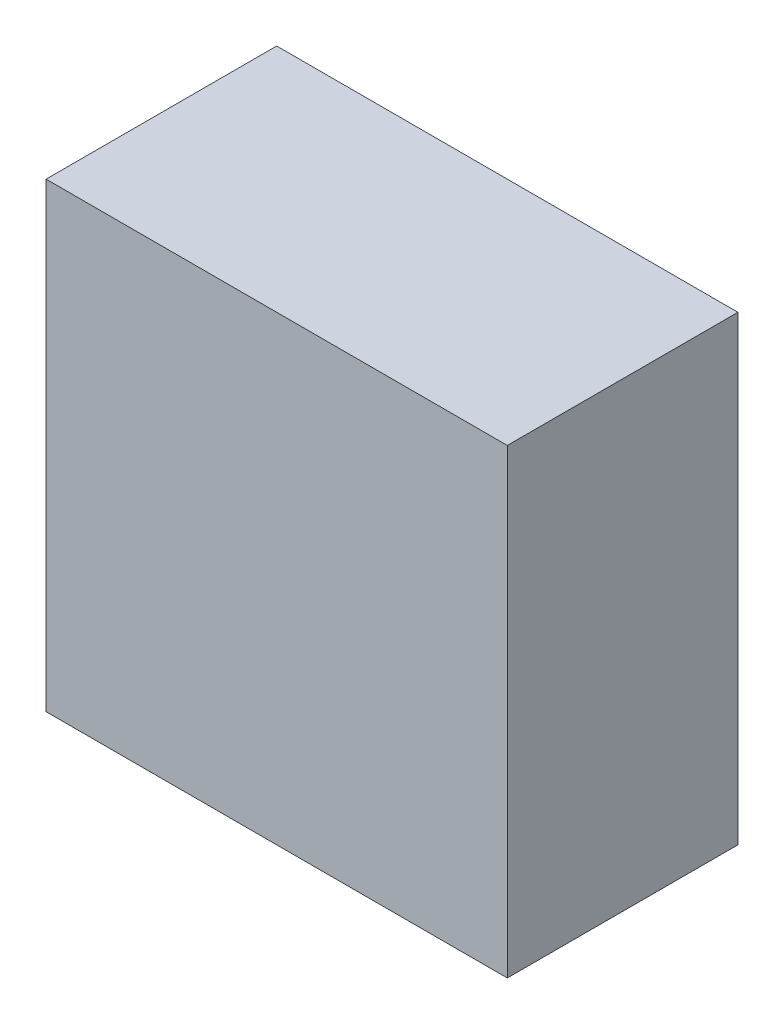
ISO-10303-21;
HEADER;
FILE_DESCRIPTION(('STEP AP214'),'2;1');
FILE_NAME('part.step','',(''),(''),'','','');
FILE_SCHEMA(('AUTOMOTIVE_DESIGN { 1 0 10303 214 1 1 1 1 }'));
ENDSEC;
DATA;
#1=APPLICATION_CONTEXT('core data for automotive mechanical design processes');
#2=APPLICATION_PROTOCOL_DEFINITION('international standard','automotive_design',2000,#1);
#3=PRODUCT_CONTEXT('',#1,'mechanical');
#4=PRODUCT('Part','Part','',(#3));
#5=PRODUCT_RELATED_PRODUCT_CATEGORY('part','',(#4));
#6=PRODUCT_DEFINITION_FORMATION('','',#4);
#7=PRODUCT_DEFINITION_CONTEXT('part definition',#1,'design');
#8=PRODUCT_DEFINITION('design','',#6,#7);
#9=PRODUCT_DEFINITION_SHAPE('','',#8);
#10=(LENGTH_UNIT() NAMED_UNIT(*) SI_UNIT(.MILLI.,.METRE.));
#11=(NAMED_UNIT(*) PLANE_ANGLE_UNIT() SI_UNIT($,.RADIAN.));
#12=(NAMED_UNIT(*) SI_UNIT($,.STERADIAN.) SOLID_ANGLE_UNIT());
#13=UNCERTAINTY_MEASURE_WITH_UNIT(LENGTH_MEASURE(1.E-05),#10,'distance_accuracy_value','');
#14=(GEOMETRIC_REPRESENTATION_CONTEXT(3) GLOBAL_UNCERTAINTY_ASSIGNED_CONTEXT((#13)) GLOBAL_UNIT_ASSIGNED_CONTEXT((#10,
#11,#12)) REPRESENTATION_CONTEXT('',''));
#15=CARTESIAN_POINT('',(0.,0.,0.));
#16=DIRECTION('',(0.,0.,1.));
#17=DIRECTION('',(1.,0.,0.));
#18=AXIS2_PLACEMENT_3D('',#15,#16,#17);
#19=CARTESIAN_POINT('',(-1.,-1.,1.));
#20=DIRECTION('',(1.,0.,0.));
#21=DIRECTION('',(0.,0.,-1.));
#22=AXIS2_PLACEMENT_3D('',#19,#20,#21);
#23=PLANE('',#22);
#24=DIRECTION('',(0.,-1.,0.));
#25=VECTOR('',#24,1.);
#26=CARTESIAN_POINT('',(-1.,-1.,0.));
#27=LINE('',#26,#25);
#28=CARTESIAN_POINT('',(-1.,1.,0.));
#29=VERTEX_POINT('',#28);
#30=CARTESIAN_POINT('',(-1.,-1.,0.));
#31=VERTEX_POINT('',#30);
#32=EDGE_CURVE('E95',#29,#31,#27,.T.);
#33=ORIENTED_EDGE('',*,*,#32,.T.);
#34=DIRECTION('',(0.,0.,-1.));
#35=VECTOR('',#34,1.);
#36=CARTESIAN_POINT('',(-1.,-1.,1.));
#37=LINE('',#36,#35);
#38=CARTESIAN_POINT('',(-1.,-1.,1.));
#39=VERTEX_POINT('',#38);
#40=EDGE_CURVE('E11',#39,#31,#37,.T.);
#41=ORIENTED_EDGE('',*,*,#40,.F.);
#42=DIRECTION('',(0.,-1.,0.));
#43=VECTOR('',#42,1.);
#44=CARTESIAN_POINT('',(-1.,-1.,1.));
#45=LINE('',#44,#43);
#46=CARTESIAN_POINT('',(-1.,1.,1.));
#47=VERTEX_POINT('',#46);
#48=EDGE_CURVE('E83',#47,#39,#45,.T.);
#49=ORIENTED_EDGE('',*,*,#48,.F.);
#50=DIRECTION('',(0.,0.,-1.));
#51=VECTOR('',#50,1.);
#52=CARTESIAN_POINT('',(-1.,1.,1.));
#53=LINE('',#52,#51);
#54=EDGE_CURVE('E91',#47,#29,#53,.T.);
#55=ORIENTED_EDGE('',*,*,#54,.T.);
#56=EDGE_LOOP('',(#33,#41,#49,#55));
#57=FACE_BOUND('',#56,.T.);
#58=ADVANCED_FACE('F32',(#57),#23,.F.);
#59=CARTESIAN_POINT('',(1.,-1.,1.));
#60=DIRECTION('',(0.,1.,0.));
#61=DIRECTION('',(0.,0.,1.));
#62=AXIS2_PLACEMENT_3D('',#59,#60,#61);
#63=PLANE('',#62);
#64=DIRECTION('',(1.,0.,0.));
#65=VECTOR('',#64,1.);
#66=CARTESIAN_POINT('',(1.,-1.,0.));
#67=LINE('',#66,#65);
#68=CARTESIAN_POINT('',(1.,-1.,0.));
#69=VERTEX_POINT('',#68);
#70=EDGE_CURVE('E87',#31,#69,#67,.T.);
#71=ORIENTED_EDGE('',*,*,#70,.T.);
#72=DIRECTION('',(0.,0.,-1.));
#73=VECTOR('',#72,1.);
#74=CARTESIAN_POINT('',(1.,-1.,1.));
#75=LINE('',#74,#73);
#76=CARTESIAN_POINT('',(1.,-1.,1.));
#77=VERTEX_POINT('',#76);
#78=EDGE_CURVE('E40',#77,#69,#75,.T.);
#79=ORIENTED_EDGE('',*,*,#78,.F.);
#80=DIRECTION('',(1.,0.,0.));
#81=VECTOR('',#80,1.);
#82=CARTESIAN_POINT('',(1.,-1.,1.));
#83=LINE('',#82,#81);
#84=EDGE_CURVE('E78',#39,#77,#83,.T.);
#85=ORIENTED_EDGE('',*,*,#84,.F.);
#86=ORIENTED_EDGE('',*,*,#40,.T.);
#87=EDGE_LOOP('',(#71,#79,#85,#86));
#88=FACE_BOUND('',#87,.T.);
#89=ADVANCED_FACE('F86',(#88),#63,.F.);
#90=CARTESIAN_POINT('',(1.,1.,1.));
#91=DIRECTION('',(-1.,0.,0.));
#92=DIRECTION('',(0.,0.,1.));
#93=AXIS2_PLACEMENT_3D('',#90,#91,#92);
#94=PLANE('',#93);
#95=DIRECTION('',(0.,1.,0.));
#96=VECTOR('',#95,1.);
#97=CARTESIAN_POINT('',(1.,1.,0.));
#98=LINE('',#97,#96);
#99=CARTESIAN_POINT('',(1.,1.,0.));
#100=VERTEX_POINT('',#99);
#101=EDGE_CURVE('E65',#69,#100,#98,.T.);
#102=ORIENTED_EDGE('',*,*,#101,.T.);
#103=DIRECTION('',(0.,0.,-1.));
#104=VECTOR('',#103,1.);
#105=CARTESIAN_POINT('',(1.,1.,1.));
#106=LINE('',#105,#104);
#107=CARTESIAN_POINT('',(1.,1.,1.));
#108=VERTEX_POINT('',#107);
#109=EDGE_CURVE('E88',#108,#100,#106,.T.);
#110=ORIENTED_EDGE('',*,*,#109,.F.);
#111=DIRECTION('',(0.,1.,0.));
#112=VECTOR('',#111,1.);
#113=CARTESIAN_POINT('',(1.,1.,1.));
#114=LINE('',#113,#112);
#115=EDGE_CURVE('E81',#77,#108,#114,.T.);
#116=ORIENTED_EDGE('',*,*,#115,.F.);
#117=ORIENTED_EDGE('',*,*,#78,.T.);
#118=EDGE_LOOP('',(#102,#110,#116,#117));
#119=FACE_BOUND('',#118,.T.);
#120=ADVANCED_FACE('F89',(#119),#94,.F.);
#121=CARTESIAN_POINT('',(-1.,1.,1.));
#122=DIRECTION('',(0.,-1.,0.));
#123=DIRECTION('',(0.,0.,-1.));
#124=AXIS2_PLACEMENT_3D('',#121,#122,#123);
#125=PLANE('',#124);
#126=DIRECTION('',(-1.,0.,0.));
#127=VECTOR('',#126,1.);
#128=CARTESIAN_POINT('',(-1.,1.,0.));
#129=LINE('',#128,#127);
#130=EDGE_CURVE('E71',#100,#29,#129,.T.);
#131=ORIENTED_EDGE('',*,*,#130,.T.);
#132=ORIENTED_EDGE('',*,*,#54,.F.);
#133=DIRECTION('',(-1.,0.,0.));
#134=VECTOR('',#133,1.);
#135=CARTESIAN_POINT('',(-1.,1.,1.));
#136=LINE('',#135,#134);
#137=EDGE_CURVE('E48',#108,#47,#136,.T.);
#138=ORIENTED_EDGE('',*,*,#137,.F.);
#139=ORIENTED_EDGE('',*,*,#109,.T.);
#140=EDGE_LOOP('',(#131,#132,#138,#139));
#141=FACE_BOUND('',#140,.T.);
#142=ADVANCED_FACE('F102',(#141),#125,.F.);
#143=CARTESIAN_POINT('',(0.,0.,1.));
#144=DIRECTION('',(0.,0.,-1.));
#145=DIRECTION('',(-1.,0.,0.));
#146=AXIS2_PLACEMENT_3D('',#143,#144,#145);
#147=PLANE('',#146);
#148=ORIENTED_EDGE('',*,*,#48,.T.);
#149=ORIENTED_EDGE('',*,*,#84,.T.);
#150=ORIENTED_EDGE('',*,*,#115,.T.);
#151=ORIENTED_EDGE('',*,*,#137,.T.);
#152=EDGE_LOOP('',(#148,#149,#150,#151));
#153=FACE_BOUND('',#152,.T.);
#154=ADVANCED_FACE('F79',(#153),#147,.F.);
#155=CARTESIAN_POINT('',(0.,0.,0.));
#156=DIRECTION('',(0.,0.,-1.));
#157=DIRECTION('',(-1.,0.,0.));
#158=AXIS2_PLACEMENT_3D('',#155,#156,#157);
#159=PLANE('',#158);
#160=ORIENTED_EDGE('',*,*,#32,.F.);
#161=ORIENTED_EDGE('',*,*,#130,.F.);
#162=ORIENTED_EDGE('',*,*,#101,.F.);
#163=ORIENTED_EDGE('',*,*,#70,.F.);
#164=EDGE_LOOP('',(#160,#161,#162,#163));
#165=FACE_BOUND('',#164,.T.);
#166=ADVANCED_FACE('F105',(#165),#159,.T.);
#167=CLOSED_SHELL('',(#58,#89,#120,#142,#154,#166));
#168=MANIFOLD_SOLID_BREP('B2',#167);
#169=ADVANCED_BREP_SHAPE_REPRESENTATION('',(#18,#168),#14);
#170=SHAPE_DEFINITION_REPRESENTATION(#9,#169);
ENDSEC;
END-ISO-10303-21;
